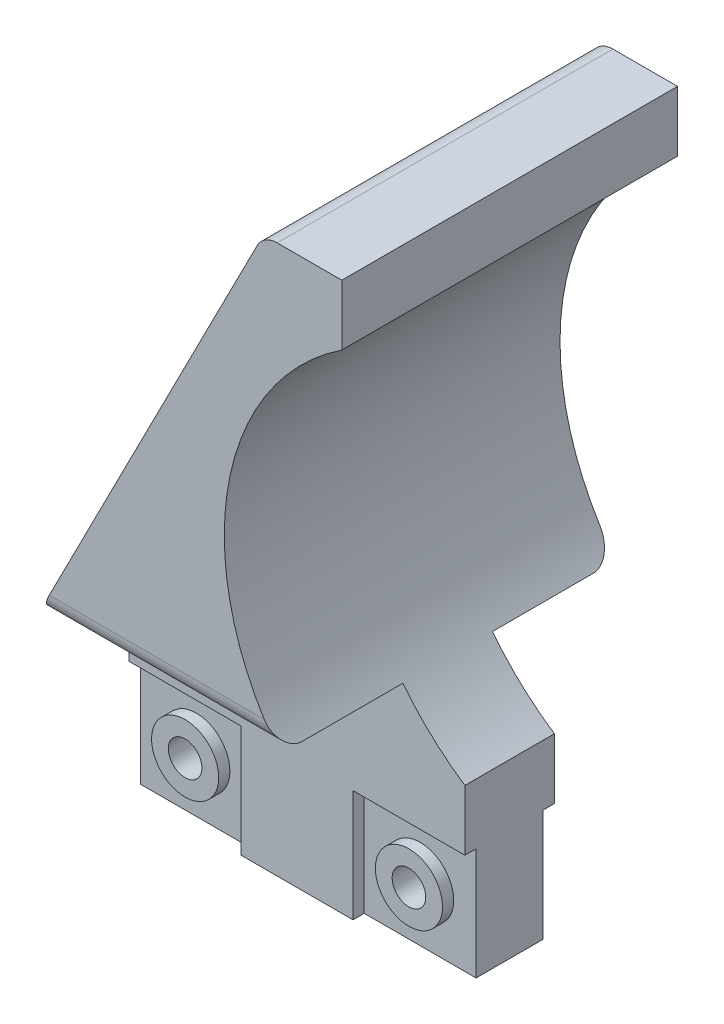
ISO-10303-21;
HEADER;
FILE_DESCRIPTION(('STEP AP214'),'2;1');
FILE_NAME('part.step','',(''),(''),'','','');
FILE_SCHEMA(('AUTOMOTIVE_DESIGN { 1 0 10303 214 1 1 1 1 }'));
ENDSEC;
DATA;
#1=APPLICATION_CONTEXT('core data for automotive mechanical design processes');
#2=APPLICATION_PROTOCOL_DEFINITION('international standard','automotive_design',2000,#1);
#3=PRODUCT_CONTEXT('',#1,'mechanical');
#4=PRODUCT('Part','Part','',(#3));
#5=PRODUCT_RELATED_PRODUCT_CATEGORY('part','',(#4));
#6=PRODUCT_DEFINITION_FORMATION('','',#4);
#7=PRODUCT_DEFINITION_CONTEXT('part definition',#1,'design');
#8=PRODUCT_DEFINITION('design','',#6,#7);
#9=PRODUCT_DEFINITION_SHAPE('','',#8);
#10=(LENGTH_UNIT() NAMED_UNIT(*) SI_UNIT(.MILLI.,.METRE.));
#11=(NAMED_UNIT(*) PLANE_ANGLE_UNIT() SI_UNIT($,.RADIAN.));
#12=(NAMED_UNIT(*) SI_UNIT($,.STERADIAN.) SOLID_ANGLE_UNIT());
#13=UNCERTAINTY_MEASURE_WITH_UNIT(LENGTH_MEASURE(1.E-05),#10,'distance_accuracy_value','');
#14=(GEOMETRIC_REPRESENTATION_CONTEXT(3) GLOBAL_UNCERTAINTY_ASSIGNED_CONTEXT((#13)) GLOBAL_UNIT_ASSIGNED_CONTEXT((#10,
#11,#12)) REPRESENTATION_CONTEXT('',''));
#15=CARTESIAN_POINT('',(0.,0.,0.));
#16=DIRECTION('',(0.,0.,1.));
#17=DIRECTION('',(1.,0.,0.));
#18=AXIS2_PLACEMENT_3D('',#15,#16,#17);
#19=CARTESIAN_POINT('',(28.0357142857143,35.,0.));
#20=DIRECTION('',(0.,0.,1.));
#21=DIRECTION('',(1.,0.,0.));
#22=AXIS2_PLACEMENT_3D('',#19,#20,#21);
#23=PLANE('',#22);
#24=CARTESIAN_POINT('',(10.,5.,0.));
#25=DIRECTION('',(0.,0.,1.));
#26=DIRECTION('',(1.,0.,0.));
#27=AXIS2_PLACEMENT_3D('',#24,#25,#26);
#28=CIRCLE('',#27,1.5);
#29=CARTESIAN_POINT('',(11.5,5.,0.));
#30=VERTEX_POINT('',#29);
#31=EDGE_CURVE('E503',#30,#30,#28,.T.);
#32=ORIENTED_EDGE('',*,*,#31,.T.);
#33=EDGE_LOOP('',(#32));
#34=FACE_BOUND('',#33,.T.);
#35=CARTESIAN_POINT('',(10.,5.,0.));
#36=DIRECTION('',(0.,0.,-1.));
#37=DIRECTION('',(-1.,0.,0.));
#38=AXIS2_PLACEMENT_3D('',#35,#36,#37);
#39=CIRCLE('',#38,3.);
#40=CARTESIAN_POINT('',(7.00000000000001,5.,0.));
#41=VERTEX_POINT('',#40);
#42=EDGE_CURVE('E607',#41,#41,#39,.T.);
#43=ORIENTED_EDGE('',*,*,#42,.T.);
#44=EDGE_LOOP('',(#43));
#45=FACE_BOUND('',#44,.T.);
#46=ADVANCED_FACE('F39',(#34,#45),#23,.F.);
#47=CARTESIAN_POINT('',(-9.99999999999999,5.,0.));
#48=DIRECTION('',(0.,0.,1.));
#49=DIRECTION('',(1.,0.,0.));
#50=AXIS2_PLACEMENT_3D('',#47,#48,#49);
#51=CIRCLE('',#50,1.5);
#52=CARTESIAN_POINT('',(-8.49999999999999,5.,0.));
#53=VERTEX_POINT('',#52);
#54=EDGE_CURVE('E614',#53,#53,#51,.T.);
#55=ORIENTED_EDGE('',*,*,#54,.T.);
#56=EDGE_LOOP('',(#55));
#57=FACE_BOUND('',#56,.T.);
#58=CARTESIAN_POINT('',(-9.99999999999999,5.,0.));
#59=DIRECTION('',(0.,0.,-1.));
#60=DIRECTION('',(-1.,0.,0.));
#61=AXIS2_PLACEMENT_3D('',#58,#59,#60);
#62=CIRCLE('',#61,3.);
#63=CARTESIAN_POINT('',(-13.,5.,0.));
#64=VERTEX_POINT('',#63);
#65=EDGE_CURVE('E597',#64,#64,#62,.T.);
#66=ORIENTED_EDGE('',*,*,#65,.T.);
#67=EDGE_LOOP('',(#66));
#68=FACE_BOUND('',#67,.T.);
#69=ADVANCED_FACE('F334',(#57,#68),#23,.F.);
#70=CARTESIAN_POINT('',(15.,10.,8.));
#71=DIRECTION('',(0.,1.,0.));
#72=DIRECTION('',(0.,0.,1.));
#73=AXIS2_PLACEMENT_3D('',#70,#71,#72);
#74=PLANE('',#73);
#75=DIRECTION('',(1.,0.,0.));
#76=VECTOR('',#75,1.);
#77=CARTESIAN_POINT('',(15.,10.,7.));
#78=LINE('',#77,#76);
#79=CARTESIAN_POINT('',(5.,10.,7.));
#80=VERTEX_POINT('',#79);
#81=CARTESIAN_POINT('',(15.,10.,7.));
#82=VERTEX_POINT('',#81);
#83=EDGE_CURVE('E243',#80,#82,#78,.T.);
#84=ORIENTED_EDGE('',*,*,#83,.T.);
#85=DIRECTION('',(0.,0.,-1.));
#86=VECTOR('',#85,1.);
#87=CARTESIAN_POINT('',(15.,10.,8.));
#88=LINE('',#87,#86);
#89=CARTESIAN_POINT('',(15.,10.,8.));
#90=VERTEX_POINT('',#89);
#91=EDGE_CURVE('E361',#90,#82,#88,.T.);
#92=ORIENTED_EDGE('',*,*,#91,.F.);
#93=DIRECTION('',(1.,0.,0.));
#94=VECTOR('',#93,1.);
#95=CARTESIAN_POINT('',(15.,10.,8.));
#96=LINE('',#95,#94);
#97=CARTESIAN_POINT('',(5.,10.,8.));
#98=VERTEX_POINT('',#97);
#99=EDGE_CURVE('E242',#98,#90,#96,.T.);
#100=ORIENTED_EDGE('',*,*,#99,.F.);
#101=DIRECTION('',(0.,0.,-1.));
#102=VECTOR('',#101,1.);
#103=CARTESIAN_POINT('',(5.,10.,8.));
#104=LINE('',#103,#102);
#105=EDGE_CURVE('E431',#98,#80,#104,.T.);
#106=ORIENTED_EDGE('',*,*,#105,.T.);
#107=EDGE_LOOP('',(#84,#92,#100,#106));
#108=FACE_BOUND('',#107,.T.);
#109=ADVANCED_FACE('F339',(#108),#74,.F.);
#110=CARTESIAN_POINT('',(5.,10.,8.));
#111=DIRECTION('',(-1.,0.,0.));
#112=DIRECTION('',(0.,0.,1.));
#113=AXIS2_PLACEMENT_3D('',#110,#111,#112);
#114=PLANE('',#113);
#115=DIRECTION('',(0.,1.,0.));
#116=VECTOR('',#115,1.);
#117=CARTESIAN_POINT('',(5.,10.,7.));
#118=LINE('',#117,#116);
#119=CARTESIAN_POINT('',(5.,0.,7.));
#120=VERTEX_POINT('',#119);
#121=EDGE_CURVE('E249',#120,#80,#118,.T.);
#122=ORIENTED_EDGE('',*,*,#121,.T.);
#123=ORIENTED_EDGE('',*,*,#105,.F.);
#124=DIRECTION('',(0.,1.,0.));
#125=VECTOR('',#124,1.);
#126=CARTESIAN_POINT('',(5.,10.,8.));
#127=LINE('',#126,#125);
#128=CARTESIAN_POINT('',(5.,0.,8.));
#129=VERTEX_POINT('',#128);
#130=EDGE_CURVE('E43',#129,#98,#127,.T.);
#131=ORIENTED_EDGE('',*,*,#130,.F.);
#132=DIRECTION('',(0.,0.,-1.));
#133=VECTOR('',#132,1.);
#134=CARTESIAN_POINT('',(5.,0.,8.));
#135=LINE('',#134,#133);
#136=EDGE_CURVE('E438',#129,#120,#135,.T.);
#137=ORIENTED_EDGE('',*,*,#136,.T.);
#138=EDGE_LOOP('',(#122,#123,#131,#137));
#139=FACE_BOUND('',#138,.T.);
#140=ADVANCED_FACE('F349',(#139),#114,.F.);
#141=CARTESIAN_POINT('',(28.0357142857143,35.,8.));
#142=DIRECTION('',(0.,0.,1.));
#143=DIRECTION('',(1.,0.,0.));
#144=AXIS2_PLACEMENT_3D('',#141,#142,#143);
#145=PLANE('',#144);
#146=ORIENTED_EDGE('',*,*,#99,.T.);
#147=DIRECTION('',(0.,1.,0.));
#148=VECTOR('',#147,1.);
#149=CARTESIAN_POINT('',(15.,15.4040820577346,8.));
#150=LINE('',#149,#148);
#151=CARTESIAN_POINT('',(15.,15.4040820577346,8.));
#152=VERTEX_POINT('',#151);
#153=EDGE_CURVE('E248',#90,#152,#150,.T.);
#154=ORIENTED_EDGE('',*,*,#153,.T.);
#155=CARTESIAN_POINT('',(28.0357142857143,35.,8.));
#156=DIRECTION('',(0.,0.,-1.));
#157=DIRECTION('',(1.,0.,0.));
#158=AXIS2_PLACEMENT_3D('',#155,#156,#157);
#159=CIRCLE('',#158,23.5357142857143);
#160=CARTESIAN_POINT('',(9.46277817081413,20.5440015560802,8.));
#161=VERTEX_POINT('',#160);
#162=EDGE_CURVE('E382',#152,#161,#159,.T.);
#163=ORIENTED_EDGE('',*,*,#162,.T.);
#164=DIRECTION('',(1.,0.,0.));
#165=VECTOR('',#164,1.);
#166=CARTESIAN_POINT('',(28.0357142857143,20.5440015560802,8.));
#167=LINE('',#166,#165);
#168=CARTESIAN_POINT('',(-12.1663992046701,20.5440015560802,8.));
#169=VERTEX_POINT('',#168);
#170=EDGE_CURVE('E396',#169,#161,#167,.T.);
#171=ORIENTED_EDGE('',*,*,#170,.F.);
#172=DIRECTION('',(-0.455111059789108,-0.890434682196081,0.));
#173=VECTOR('',#172,1.);
#174=CARTESIAN_POINT('',(-15.,15.,8.));
#175=LINE('',#174,#173);
#176=CARTESIAN_POINT('',(-15.,15.,8.));
#177=VERTEX_POINT('',#176);
#178=EDGE_CURVE('E378',#169,#177,#175,.T.);
#179=ORIENTED_EDGE('',*,*,#178,.T.);
#180=DIRECTION('',(0.,-1.,0.));
#181=VECTOR('',#180,1.);
#182=CARTESIAN_POINT('',(-15.,0.,8.));
#183=LINE('',#182,#181);
#184=CARTESIAN_POINT('',(-15.,10.,8.));
#185=VERTEX_POINT('',#184);
#186=EDGE_CURVE('E381',#177,#185,#183,.T.);
#187=ORIENTED_EDGE('',*,*,#186,.T.);
#188=DIRECTION('',(1.,0.,0.));
#189=VECTOR('',#188,1.);
#190=CARTESIAN_POINT('',(-15.,10.,8.));
#191=LINE('',#190,#189);
#192=CARTESIAN_POINT('',(-5.,10.,8.));
#193=VERTEX_POINT('',#192);
#194=EDGE_CURVE('E395',#185,#193,#191,.T.);
#195=ORIENTED_EDGE('',*,*,#194,.T.);
#196=DIRECTION('',(0.,-1.,0.));
#197=VECTOR('',#196,1.);
#198=CARTESIAN_POINT('',(-5.,10.,8.));
#199=LINE('',#198,#197);
#200=CARTESIAN_POINT('',(-5.,0.,8.));
#201=VERTEX_POINT('',#200);
#202=EDGE_CURVE('E391',#193,#201,#199,.T.);
#203=ORIENTED_EDGE('',*,*,#202,.T.);
#204=DIRECTION('',(1.,0.,0.));
#205=VECTOR('',#204,1.);
#206=CARTESIAN_POINT('',(-15.,0.,8.));
#207=LINE('',#206,#205);
#208=EDGE_CURVE('E387',#201,#129,#207,.T.);
#209=ORIENTED_EDGE('',*,*,#208,.T.);
#210=ORIENTED_EDGE('',*,*,#130,.T.);
#211=EDGE_LOOP('',(#146,#154,#163,#171,#179,#187,#195,#203,#209,#210));
#212=FACE_BOUND('',#211,.T.);
#213=ADVANCED_FACE('F344',(#212),#145,.T.);
#214=DIRECTION('',(0.,1.,0.));
#215=VECTOR('',#214,1.);
#216=CARTESIAN_POINT('',(15.,15.4040820577346,0.));
#217=LINE('',#216,#215);
#218=CARTESIAN_POINT('',(15.,10.,0.));
#219=VERTEX_POINT('',#218);
#220=CARTESIAN_POINT('',(15.,15.4040820577346,0.));
#221=VERTEX_POINT('',#220);
#222=EDGE_CURVE('E291',#219,#221,#217,.T.);
#223=ORIENTED_EDGE('',*,*,#222,.F.);
#224=DIRECTION('',(1.,0.,0.));
#225=VECTOR('',#224,1.);
#226=CARTESIAN_POINT('',(15.,10.,0.));
#227=LINE('',#226,#225);
#228=CARTESIAN_POINT('',(5.,10.,0.));
#229=VERTEX_POINT('',#228);
#230=EDGE_CURVE('E224',#229,#219,#227,.T.);
#231=ORIENTED_EDGE('',*,*,#230,.F.);
#232=DIRECTION('',(0.,1.,0.));
#233=VECTOR('',#232,1.);
#234=CARTESIAN_POINT('',(5.,10.,0.));
#235=LINE('',#234,#233);
#236=CARTESIAN_POINT('',(5.,0.,0.));
#237=VERTEX_POINT('',#236);
#238=EDGE_CURVE('E657',#237,#229,#235,.T.);
#239=ORIENTED_EDGE('',*,*,#238,.F.);
#240=DIRECTION('',(1.,0.,0.));
#241=VECTOR('',#240,1.);
#242=CARTESIAN_POINT('',(-15.,0.,0.));
#243=LINE('',#242,#241);
#244=CARTESIAN_POINT('',(-5.,0.,0.));
#245=VERTEX_POINT('',#244);
#246=EDGE_CURVE('E369',#245,#237,#243,.T.);
#247=ORIENTED_EDGE('',*,*,#246,.F.);
#248=DIRECTION('',(0.,-1.,0.));
#249=VECTOR('',#248,1.);
#250=CARTESIAN_POINT('',(-5.,10.,0.));
#251=LINE('',#250,#249);
#252=CARTESIAN_POINT('',(-5.,10.,0.));
#253=VERTEX_POINT('',#252);
#254=EDGE_CURVE('E587',#253,#245,#251,.T.);
#255=ORIENTED_EDGE('',*,*,#254,.F.);
#256=DIRECTION('',(1.,0.,0.));
#257=VECTOR('',#256,1.);
#258=CARTESIAN_POINT('',(-15.,10.,0.));
#259=LINE('',#258,#257);
#260=CARTESIAN_POINT('',(-15.,10.,0.));
#261=VERTEX_POINT('',#260);
#262=EDGE_CURVE('E585',#261,#253,#259,.T.);
#263=ORIENTED_EDGE('',*,*,#262,.F.);
#264=DIRECTION('',(0.,-1.,0.));
#265=VECTOR('',#264,1.);
#266=CARTESIAN_POINT('',(-15.,0.,0.));
#267=LINE('',#266,#265);
#268=CARTESIAN_POINT('',(-15.,15.,0.));
#269=VERTEX_POINT('',#268);
#270=EDGE_CURVE('E373',#269,#261,#267,.T.);
#271=ORIENTED_EDGE('',*,*,#270,.F.);
#272=DIRECTION('',(-0.455111059789108,-0.890434682196081,0.));
#273=VECTOR('',#272,1.);
#274=CARTESIAN_POINT('',(-15.,15.,0.));
#275=LINE('',#274,#273);
#276=CARTESIAN_POINT('',(-12.1663992046701,20.5440015560802,0.));
#277=VERTEX_POINT('',#276);
#278=EDGE_CURVE('E408',#277,#269,#275,.T.);
#279=ORIENTED_EDGE('',*,*,#278,.F.);
#280=DIRECTION('',(1.,0.,0.));
#281=VECTOR('',#280,1.);
#282=CARTESIAN_POINT('',(28.0357142857143,20.5440015560802,0.));
#283=LINE('',#282,#281);
#284=CARTESIAN_POINT('',(9.46277817081413,20.5440015560802,0.));
#285=VERTEX_POINT('',#284);
#286=EDGE_CURVE('E377',#277,#285,#283,.T.);
#287=ORIENTED_EDGE('',*,*,#286,.T.);
#288=CARTESIAN_POINT('',(28.0357142857143,35.,0.));
#289=DIRECTION('',(0.,0.,-1.));
#290=DIRECTION('',(1.,0.,0.));
#291=AXIS2_PLACEMENT_3D('',#288,#289,#290);
#292=CIRCLE('',#291,23.5357142857143);
#293=EDGE_CURVE('E357',#221,#285,#292,.T.);
#294=ORIENTED_EDGE('',*,*,#293,.F.);
#295=EDGE_LOOP('',(#223,#231,#239,#247,#255,#263,#271,#279,#287,#294));
#296=FACE_BOUND('',#295,.T.);
#297=ADVANCED_FACE('F41',(#296),#23,.F.);
#298=CARTESIAN_POINT('',(-15.,0.,8.));
#299=DIRECTION('',(1.,0.,0.));
#300=DIRECTION('',(0.,0.,-1.));
#301=AXIS2_PLACEMENT_3D('',#298,#299,#300);
#302=PLANE('',#301);
#303=ORIENTED_EDGE('',*,*,#270,.T.);
#304=DIRECTION('',(0.,0.,-1.));
#305=VECTOR('',#304,1.);
#306=CARTESIAN_POINT('',(-15.,10.,1.));
#307=LINE('',#306,#305);
#308=CARTESIAN_POINT('',(-15.,10.,1.));
#309=VERTEX_POINT('',#308);
#310=EDGE_CURVE('E611',#309,#261,#307,.T.);
#311=ORIENTED_EDGE('',*,*,#310,.F.);
#312=DIRECTION('',(0.,1.,0.));
#313=VECTOR('',#312,1.);
#314=CARTESIAN_POINT('',(-15.,10.,1.));
#315=LINE('',#314,#313);
#316=CARTESIAN_POINT('',(-15.,0.,1.));
#317=VERTEX_POINT('',#316);
#318=EDGE_CURVE('E594',#317,#309,#315,.T.);
#319=ORIENTED_EDGE('',*,*,#318,.F.);
#320=DIRECTION('',(0.,0.,-1.));
#321=VECTOR('',#320,1.);
#322=CARTESIAN_POINT('',(-15.,0.,7.));
#323=LINE('',#322,#321);
#324=CARTESIAN_POINT('',(-15.,0.,7.));
#325=VERTEX_POINT('',#324);
#326=EDGE_CURVE('E490',#325,#317,#323,.T.);
#327=ORIENTED_EDGE('',*,*,#326,.F.);
#328=DIRECTION('',(0.,1.,0.));
#329=VECTOR('',#328,1.);
#330=CARTESIAN_POINT('',(-15.,10.,7.));
#331=LINE('',#330,#329);
#332=CARTESIAN_POINT('',(-15.,10.,7.));
#333=VERTEX_POINT('',#332);
#334=EDGE_CURVE('E488',#325,#333,#331,.T.);
#335=ORIENTED_EDGE('',*,*,#334,.T.);
#336=DIRECTION('',(0.,0.,-1.));
#337=VECTOR('',#336,1.);
#338=CARTESIAN_POINT('',(-15.,10.,8.));
#339=LINE('',#338,#337);
#340=EDGE_CURVE('E11',#185,#333,#339,.T.);
#341=ORIENTED_EDGE('',*,*,#340,.F.);
#342=ORIENTED_EDGE('',*,*,#186,.F.);
#343=DIRECTION('',(0.,0.,-1.));
#344=VECTOR('',#343,1.);
#345=CARTESIAN_POINT('',(-15.,15.,8.));
#346=LINE('',#345,#344);
#347=EDGE_CURVE('E372',#177,#269,#346,.T.);
#348=ORIENTED_EDGE('',*,*,#347,.T.);
#349=EDGE_LOOP('',(#303,#311,#319,#327,#335,#341,#342,#348));
#350=FACE_BOUND('',#349,.T.);
#351=ADVANCED_FACE('F326',(#350),#302,.F.);
#352=CARTESIAN_POINT('',(-15.,0.,8.));
#353=DIRECTION('',(0.,1.,0.));
#354=DIRECTION('',(0.,0.,1.));
#355=AXIS2_PLACEMENT_3D('',#352,#353,#354);
#356=PLANE('',#355);
#357=ORIENTED_EDGE('',*,*,#246,.T.);
#358=DIRECTION('',(0.,0.,-1.));
#359=VECTOR('',#358,1.);
#360=CARTESIAN_POINT('',(5.,0.,1.));
#361=LINE('',#360,#359);
#362=CARTESIAN_POINT('',(5.,0.,1.));
#363=VERTEX_POINT('',#362);
#364=EDGE_CURVE('E232',#363,#237,#361,.T.);
#365=ORIENTED_EDGE('',*,*,#364,.F.);
#366=DIRECTION('',(-1.,0.,0.));
#367=VECTOR('',#366,1.);
#368=CARTESIAN_POINT('',(15.,0.,1.));
#369=LINE('',#368,#367);
#370=CARTESIAN_POINT('',(15.,0.,1.));
#371=VERTEX_POINT('',#370);
#372=EDGE_CURVE('E218',#371,#363,#369,.T.);
#373=ORIENTED_EDGE('',*,*,#372,.F.);
#374=DIRECTION('',(0.,0.,-1.));
#375=VECTOR('',#374,1.);
#376=CARTESIAN_POINT('',(15.,0.,7.));
#377=LINE('',#376,#375);
#378=CARTESIAN_POINT('',(15.,0.,7.));
#379=VERTEX_POINT('',#378);
#380=EDGE_CURVE('E230',#379,#371,#377,.T.);
#381=ORIENTED_EDGE('',*,*,#380,.F.);
#382=DIRECTION('',(-1.,0.,0.));
#383=VECTOR('',#382,1.);
#384=CARTESIAN_POINT('',(15.,0.,7.));
#385=LINE('',#384,#383);
#386=EDGE_CURVE('E460',#379,#120,#385,.T.);
#387=ORIENTED_EDGE('',*,*,#386,.T.);
#388=ORIENTED_EDGE('',*,*,#136,.F.);
#389=ORIENTED_EDGE('',*,*,#208,.F.);
#390=DIRECTION('',(0.,0.,-1.));
#391=VECTOR('',#390,1.);
#392=CARTESIAN_POINT('',(-5.,0.,8.));
#393=LINE('',#392,#391);
#394=CARTESIAN_POINT('',(-5.,0.,7.));
#395=VERTEX_POINT('',#394);
#396=EDGE_CURVE('E364',#201,#395,#393,.T.);
#397=ORIENTED_EDGE('',*,*,#396,.T.);
#398=DIRECTION('',(-1.,0.,0.));
#399=VECTOR('',#398,1.);
#400=CARTESIAN_POINT('',(-15.,0.,7.));
#401=LINE('',#400,#399);
#402=EDGE_CURVE('E482',#395,#325,#401,.T.);
#403=ORIENTED_EDGE('',*,*,#402,.T.);
#404=ORIENTED_EDGE('',*,*,#326,.T.);
#405=DIRECTION('',(-1.,0.,0.));
#406=VECTOR('',#405,1.);
#407=CARTESIAN_POINT('',(-15.,0.,1.));
#408=LINE('',#407,#406);
#409=CARTESIAN_POINT('',(-5.,0.,1.));
#410=VERTEX_POINT('',#409);
#411=EDGE_CURVE('E600',#410,#317,#408,.T.);
#412=ORIENTED_EDGE('',*,*,#411,.F.);
#413=DIRECTION('',(0.,0.,-1.));
#414=VECTOR('',#413,1.);
#415=CARTESIAN_POINT('',(-5.,0.,1.));
#416=LINE('',#415,#414);
#417=EDGE_CURVE('E603',#410,#245,#416,.T.);
#418=ORIENTED_EDGE('',*,*,#417,.T.);
#419=EDGE_LOOP('',(#357,#365,#373,#381,#387,#388,#389,#397,#403,#404,#412,#418));
#420=FACE_BOUND('',#419,.T.);
#421=ADVANCED_FACE('F228',(#420),#356,.F.);
#422=CARTESIAN_POINT('',(15.,15.4040820577346,8.));
#423=DIRECTION('',(-1.,0.,0.));
#424=DIRECTION('',(0.,-1.,0.));
#425=AXIS2_PLACEMENT_3D('',#422,#423,#424);
#426=PLANE('',#425);
#427=DIRECTION('',(0.,-1.,0.));
#428=VECTOR('',#427,1.);
#429=CARTESIAN_POINT('',(15.,10.,1.));
#430=LINE('',#429,#428);
#431=CARTESIAN_POINT('',(15.,10.,1.));
#432=VERTEX_POINT('',#431);
#433=EDGE_CURVE('E215',#432,#371,#430,.T.);
#434=ORIENTED_EDGE('',*,*,#433,.F.);
#435=DIRECTION('',(0.,0.,-1.));
#436=VECTOR('',#435,1.);
#437=CARTESIAN_POINT('',(15.,10.,1.));
#438=LINE('',#437,#436);
#439=EDGE_CURVE('E623',#432,#219,#438,.T.);
#440=ORIENTED_EDGE('',*,*,#439,.T.);
#441=ORIENTED_EDGE('',*,*,#222,.T.);
#442=DIRECTION('',(0.,0.,-1.));
#443=VECTOR('',#442,1.);
#444=CARTESIAN_POINT('',(15.,15.4040820577346,8.));
#445=LINE('',#444,#443);
#446=EDGE_CURVE('E316',#152,#221,#445,.T.);
#447=ORIENTED_EDGE('',*,*,#446,.F.);
#448=ORIENTED_EDGE('',*,*,#153,.F.);
#449=ORIENTED_EDGE('',*,*,#91,.T.);
#450=DIRECTION('',(0.,-1.,0.));
#451=VECTOR('',#450,1.);
#452=CARTESIAN_POINT('',(15.,10.,7.));
#453=LINE('',#452,#451);
#454=EDGE_CURVE('E240',#82,#379,#453,.T.);
#455=ORIENTED_EDGE('',*,*,#454,.T.);
#456=ORIENTED_EDGE('',*,*,#380,.T.);
#457=EDGE_LOOP('',(#434,#440,#441,#447,#448,#449,#455,#456));
#458=FACE_BOUND('',#457,.T.);
#459=ADVANCED_FACE('F237',(#458),#426,.F.);
#460=CARTESIAN_POINT('',(28.0357142857143,35.,8.));
#461=DIRECTION('',(0.,0.,-1.));
#462=DIRECTION('',(-1.,0.,0.));
#463=AXIS2_PLACEMENT_3D('',#460,#461,#462);
#464=CYLINDRICAL_SURFACE('',#463,23.5357142857143);
#465=DIRECTION('',(0.,0.,1.));
#466=VECTOR('',#465,1.);
#467=CARTESIAN_POINT('',(9.46277817081413,20.5440015560802,-11.));
#468=LINE('',#467,#466);
#469=CARTESIAN_POINT('',(9.46277817081413,20.5440015560802,-9.));
#470=VERTEX_POINT('',#469);
#471=EDGE_CURVE('E402',#470,#285,#468,.T.);
#472=ORIENTED_EDGE('',*,*,#471,.F.);
#473=CARTESIAN_POINT('',(9.46277817081413,20.5440015560802,-9.));
#474=CARTESIAN_POINT('',(9.46278778264955,20.5439912860713,-9.04826465668858));
#475=CARTESIAN_POINT('',(9.46141862951719,20.5457483274586,-9.09652194682469));
#476=CARTESIAN_POINT('',(9.45599625780306,20.5527178909817,-9.19260672242341));
#477=CARTESIAN_POINT('',(9.45194463063311,20.557928364327,-9.24043444569061));
#478=CARTESIAN_POINT('',(9.44126566651171,20.5716806828838,-9.33499278394975));
#479=CARTESIAN_POINT('',(9.43465535594298,20.5802005077868,-9.38172852978646));
#480=CARTESIAN_POINT('',(9.41899404248133,20.6004257795668,-9.47407889576703));
#481=CARTESIAN_POINT('',(9.40994279705968,20.6121315429963,-9.51969340401424));
#482=CARTESIAN_POINT('',(9.3794044740843,20.6517225029473,-9.65420246142124));
#483=CARTESIAN_POINT('',(9.35449908710464,20.6841244023061,-9.74104900953231));
#484=CARTESIAN_POINT('',(9.29708571391248,20.7593583044711,-9.90742638180532));
#485=CARTESIAN_POINT('',(9.26456585088897,20.8022066055816,-9.98694550407507));
#486=CARTESIAN_POINT('',(9.19055616274088,20.9005693107304,-10.1438501453988));
#487=CARTESIAN_POINT('',(9.14854676439779,20.9568384138374,-10.2205146364847));
#488=CARTESIAN_POINT('',(9.05925758771852,21.0777302689992,-10.3633851666302));
#489=CARTESIAN_POINT('',(9.01197676349062,21.1423546792192,-10.4295891239181));
#490=CARTESIAN_POINT('',(8.90359753630854,21.2922602763121,-10.5637157487919));
#491=CARTESIAN_POINT('',(8.84164554464999,21.37906858024,-10.6292452025552));
#492=CARTESIAN_POINT('',(8.71431200414487,21.5602980232691,-10.7446785123169));
#493=CARTESIAN_POINT('',(8.64892599970086,21.6547291426437,-10.79456145161));
#494=CARTESIAN_POINT('',(8.49739822649028,21.8772388770339,-10.890497833315));
#495=CARTESIAN_POINT('',(8.41067318823541,22.0072110004804,-10.9313669439443));
#496=CARTESIAN_POINT('',(8.28087630061509,22.2061517611354,-10.9724225348696));
#497=CARTESIAN_POINT('',(8.23766579792703,22.2731184119949,-10.9827330227732));
#498=CARTESIAN_POINT('',(8.15162543799745,22.4079684154694,-10.9965155426311));
#499=CARTESIAN_POINT('',(8.10879548718025,22.4758515317712,-10.9999893047829));
#500=CARTESIAN_POINT('',(8.06628891331457,22.5440015560802,-11.));
#501=B_SPLINE_CURVE_WITH_KNOTS('',3,(#473,#474,#475,#476,#477,#478,#479,#480,#481,#482,#483,
#484,#485,#486,#487,#488,#489,#490,#491,#492,#493,#494,#495,#496,#497,#498,#499,#500),
.UNSPECIFIED.,.F.,.F.,(4,2,2,2,2,2,2,2,2,2,2,2,2,4),(0.,0.144730515928066,0.289375245484268,
0.433073561271764,0.576786160036746,0.863347825112885,1.15035947272318,1.4611205861846,
1.77194346715215,2.14603502374451,2.52062456593402,3.00244935115899,3.24328702361067,
3.48406373846967),.UNSPECIFIED.);
#502=CARTESIAN_POINT('',(8.06628891331457,22.5440015560802,-11.));
#503=VERTEX_POINT('',#502);
#504=EDGE_CURVE('E281',#470,#503,#501,.T.);
#505=ORIENTED_EDGE('',*,*,#504,.T.);
#506=CARTESIAN_POINT('',(28.0357142857144,35.,-11.));
#507=DIRECTION('',(0.,0.,-1.));
#508=DIRECTION('',(1.,0.,0.));
#509=AXIS2_PLACEMENT_3D('',#506,#507,#508);
#510=CIRCLE('',#509,23.5357142857144);
#511=CARTESIAN_POINT('',(15.,54.5959179422654,-11.));
#512=VERTEX_POINT('',#511);
#513=EDGE_CURVE('E290',#503,#512,#510,.T.);
#514=ORIENTED_EDGE('',*,*,#513,.T.);
#515=DIRECTION('',(0.,0.,-1.));
#516=VECTOR('',#515,1.);
#517=CARTESIAN_POINT('',(15.,54.5959179422654,8.));
#518=LINE('',#517,#516);
#519=CARTESIAN_POINT('',(15.,54.5959179422654,19.));
#520=VERTEX_POINT('',#519);
#521=EDGE_CURVE('E419',#520,#512,#518,.T.);
#522=ORIENTED_EDGE('',*,*,#521,.F.);
#523=CARTESIAN_POINT('',(28.0357142857144,35.,19.));
#524=DIRECTION('',(0.,0.,-1.));
#525=DIRECTION('',(1.,0.,0.));
#526=AXIS2_PLACEMENT_3D('',#523,#524,#525);
#527=CIRCLE('',#526,23.5357142857144);
#528=CARTESIAN_POINT('',(8.06628891331457,22.5440015560802,19.));
#529=VERTEX_POINT('',#528);
#530=EDGE_CURVE('E432',#529,#520,#527,.T.);
#531=ORIENTED_EDGE('',*,*,#530,.F.);
#532=CARTESIAN_POINT('',(8.06628891331457,22.5440015560802,19.));
#533=CARTESIAN_POINT('',(8.1112634423205,22.4718936109539,18.9999875371441));
#534=CARTESIAN_POINT('',(8.15660118942526,22.4000843330383,18.9960991559721));
#535=CARTESIAN_POINT('',(8.24767649523542,22.2575296649002,18.9806790899556));
#536=CARTESIAN_POINT('',(8.29341412076328,22.1867844580804,18.9691461025863));
#537=CARTESIAN_POINT('',(8.43118096026569,21.9761671151226,18.9230888048595));
#538=CARTESIAN_POINT('',(8.52329779835269,21.8386598557111,18.8771081249765));
#539=CARTESIAN_POINT('',(8.69693752027963,21.5849539803893,18.7601881415762));
#540=CARTESIAN_POINT('',(8.77873250243427,21.4679300448428,18.6914203556828));
#541=CARTESIAN_POINT('',(8.93545041573926,21.2476221064516,18.5290573967925));
#542=CARTESIAN_POINT('',(9.01039546372516,21.1442933606629,18.4355462209092));
#543=CARTESIAN_POINT('',(9.12863182482456,20.9836164676011,18.2550918034805));
#544=CARTESIAN_POINT('',(9.17479271161207,20.9216323195958,18.1741368470206));
#545=CARTESIAN_POINT('',(9.2591823190664,20.8092771609555,18.0007016188246));
#546=CARTESIAN_POINT('',(9.29741120312857,20.7589059110981,17.9082215845622));
#547=CARTESIAN_POINT('',(9.36377017684191,20.6720060044009,17.7121746965955));
#548=CARTESIAN_POINT('',(9.39179555308634,20.635620677437,17.6085063055522));
#549=CARTESIAN_POINT('',(9.42394658333055,20.5940205011085,17.4479355820039));
#550=CARTESIAN_POINT('',(9.43301280415412,20.5823204742883,17.3936078653449));
#551=CARTESIAN_POINT('',(9.4476554027273,20.5634470587195,17.2837241484507));
#552=CARTESIAN_POINT('',(9.45323473836985,20.5562698332766,17.2281692307771));
#553=CARTESIAN_POINT('',(9.45891798208593,20.548962168454,17.1436865830157));
#554=CARTESIAN_POINT('',(9.46036519858975,20.5471021313182,17.1149822231271));
#555=CARTESIAN_POINT('',(9.46229495207602,20.5446223643762,17.0575205922952));
#556=CARTESIAN_POINT('',(9.46277858982471,20.5440012192924,17.0287634193335));
#557=CARTESIAN_POINT('',(9.4627781708141,20.5440015560802,17.));
#558=B_SPLINE_CURVE_WITH_KNOTS('',3,(#532,#533,#534,#535,#536,#537,#538,#539,#540,#541,#542,
#543,#544,#545,#546,#547,#548,#549,#550,#551,#552,#553,#554,#555,#556,#557),.UNSPECIFIED.,.F.,
.F.,(4,2,2,2,2,2,2,2,2,2,2,2,4),(0.,0.254745028920659,0.509533473687065,1.02171311085048,
1.49482162105064,1.966344214579,2.30084173691015,2.63533236807223,2.97316490564461,
3.14184075408737,3.3103733214321,3.39673922045515,3.48300640071759),.UNSPECIFIED.);
#559=CARTESIAN_POINT('',(9.46277817081413,20.5440015560802,17.));
#560=VERTEX_POINT('',#559);
#561=EDGE_CURVE('E308',#529,#560,#558,.T.);
#562=ORIENTED_EDGE('',*,*,#561,.T.);
#563=EDGE_CURVE('E405',#161,#560,#468,.T.);
#564=ORIENTED_EDGE('',*,*,#563,.F.);
#565=ORIENTED_EDGE('',*,*,#162,.F.);
#566=ORIENTED_EDGE('',*,*,#446,.T.);
#567=ORIENTED_EDGE('',*,*,#293,.T.);
#568=EDGE_LOOP('',(#472,#505,#514,#522,#531,#562,#564,#565,#566,#567));
#569=FACE_BOUND('',#568,.T.);
#570=ADVANCED_FACE('F297',(#569),#464,.F.);
#571=CARTESIAN_POINT('',(15.,60.,8.));
#572=DIRECTION('',(-1.,0.,0.));
#573=DIRECTION('',(0.,0.,1.));
#574=AXIS2_PLACEMENT_3D('',#571,#572,#573);
#575=PLANE('',#574);
#576=ORIENTED_EDGE('',*,*,#521,.T.);
#577=DIRECTION('',(0.,1.,0.));
#578=VECTOR('',#577,1.);
#579=CARTESIAN_POINT('',(15.,60.,-11.));
#580=LINE('',#579,#578);
#581=CARTESIAN_POINT('',(15.,60.,-11.));
#582=VERTEX_POINT('',#581);
#583=EDGE_CURVE('E415',#512,#582,#580,.T.);
#584=ORIENTED_EDGE('',*,*,#583,.T.);
#585=DIRECTION('',(0.,0.,-1.));
#586=VECTOR('',#585,1.);
#587=CARTESIAN_POINT('',(15.,60.,8.));
#588=LINE('',#587,#586);
#589=CARTESIAN_POINT('',(15.,60.,19.));
#590=VERTEX_POINT('',#589);
#591=EDGE_CURVE('E261',#590,#582,#588,.T.);
#592=ORIENTED_EDGE('',*,*,#591,.F.);
#593=DIRECTION('',(0.,1.,0.));
#594=VECTOR('',#593,1.);
#595=CARTESIAN_POINT('',(15.,60.,19.));
#596=LINE('',#595,#594);
#597=EDGE_CURVE('E427',#520,#590,#596,.T.);
#598=ORIENTED_EDGE('',*,*,#597,.F.);
#599=EDGE_LOOP('',(#576,#584,#592,#598));
#600=FACE_BOUND('',#599,.T.);
#601=ADVANCED_FACE('F302',(#600),#575,.F.);
#602=CARTESIAN_POINT('',(8.,60.,8.));
#603=DIRECTION('',(0.,-1.,0.));
#604=DIRECTION('',(0.,0.,-1.));
#605=AXIS2_PLACEMENT_3D('',#602,#603,#604);
#606=PLANE('',#605);
#607=DIRECTION('',(-1.,0.,0.));
#608=VECTOR('',#607,1.);
#609=CARTESIAN_POINT('',(8.,60.,-11.));
#610=LINE('',#609,#608);
#611=CARTESIAN_POINT('',(9.22387178106547,60.,-11.));
#612=VERTEX_POINT('',#611);
#613=EDGE_CURVE('E262',#582,#612,#610,.T.);
#614=ORIENTED_EDGE('',*,*,#613,.T.);
#615=DIRECTION('',(0.,0.,-1.));
#616=VECTOR('',#615,1.);
#617=CARTESIAN_POINT('',(9.22387178106547,60.,8.));
#618=LINE('',#617,#616);
#619=CARTESIAN_POINT('',(9.22387178106547,60.,19.));
#620=VERTEX_POINT('',#619);
#621=EDGE_CURVE('E258',#612,#620,#618,.F.);
#622=ORIENTED_EDGE('',*,*,#621,.T.);
#623=DIRECTION('',(-1.,0.,0.));
#624=VECTOR('',#623,1.);
#625=CARTESIAN_POINT('',(8.,60.,19.));
#626=LINE('',#625,#624);
#627=EDGE_CURVE('E257',#590,#620,#626,.T.);
#628=ORIENTED_EDGE('',*,*,#627,.F.);
#629=ORIENTED_EDGE('',*,*,#591,.T.);
#630=EDGE_LOOP('',(#614,#622,#628,#629));
#631=FACE_BOUND('',#630,.T.);
#632=ADVANCED_FACE('F835',(#631),#606,.F.);
#633=CARTESIAN_POINT('',(-15.,15.,8.));
#634=DIRECTION('',(0.890434682196081,-0.455111059789108,0.));
#635=DIRECTION('',(0.455111059789108,0.890434682196081,0.));
#636=AXIS2_PLACEMENT_3D('',#633,#634,#635);
#637=PLANE('',#636);
#638=DIRECTION('',(-0.455111059789108,-0.890434682196081,0.));
#639=VECTOR('',#638,1.);
#640=CARTESIAN_POINT('',(-12.1663992046701,20.5440015560802,19.));
#641=LINE('',#640,#639);
#642=CARTESIAN_POINT('',(7.44300241667331,58.9102221195782,19.));
#643=VERTEX_POINT('',#642);
#644=CARTESIAN_POINT('',(-11.1441769824479,22.5440015560802,19.));
#645=VERTEX_POINT('',#644);
#646=EDGE_CURVE('E256',#643,#645,#641,.T.);
#647=ORIENTED_EDGE('',*,*,#646,.F.);
#648=DIRECTION('',(0.,0.,-1.));
#649=VECTOR('',#648,1.);
#650=CARTESIAN_POINT('',(7.44300241667331,58.9102221195782,8.));
#651=LINE('',#650,#649);
#652=CARTESIAN_POINT('',(7.44300241667331,58.9102221195782,-11.));
#653=VERTEX_POINT('',#652);
#654=EDGE_CURVE('E268',#643,#653,#651,.T.);
#655=ORIENTED_EDGE('',*,*,#654,.T.);
#656=DIRECTION('',(-0.455111059789108,-0.890434682196081,0.));
#657=VECTOR('',#656,1.);
#658=CARTESIAN_POINT('',(-12.1663992046701,20.5440015560802,-11.));
#659=LINE('',#658,#657);
#660=CARTESIAN_POINT('',(-11.1441769824479,22.5440015560802,-11.));
#661=VERTEX_POINT('',#660);
#662=EDGE_CURVE('E272',#653,#661,#659,.T.);
#663=ORIENTED_EDGE('',*,*,#662,.T.);
#664=CARTESIAN_POINT('',(-11.1441769824479,22.5440015560802,-9.));
#665=DIRECTION('',(0.890434682196081,-0.455111059789108,0.));
#666=DIRECTION('',(-0.455111059789108,-0.890434682196081,0.));
#667=AXIS2_PLACEMENT_3D('',#664,#665,#666);
#668=ELLIPSE('',#667,2.24609400328769,2.);
#669=CARTESIAN_POINT('',(-12.1663992046701,20.5440015560802,-9.));
#670=VERTEX_POINT('',#669);
#671=EDGE_CURVE('E273',#661,#670,#668,.F.);
#672=ORIENTED_EDGE('',*,*,#671,.T.);
#673=DIRECTION('',(0.,0.,1.));
#674=VECTOR('',#673,1.);
#675=CARTESIAN_POINT('',(-12.1663992046701,20.5440015560802,-11.));
#676=LINE('',#675,#674);
#677=EDGE_CURVE('E276',#670,#277,#676,.T.);
#678=ORIENTED_EDGE('',*,*,#677,.T.);
#679=ORIENTED_EDGE('',*,*,#278,.T.);
#680=ORIENTED_EDGE('',*,*,#347,.F.);
#681=ORIENTED_EDGE('',*,*,#178,.F.);
#682=CARTESIAN_POINT('',(-12.1663992046701,20.5440015560802,17.));
#683=VERTEX_POINT('',#682);
#684=EDGE_CURVE('E409',#169,#683,#676,.T.);
#685=ORIENTED_EDGE('',*,*,#684,.T.);
#686=CARTESIAN_POINT('',(-11.1441769824479,22.5440015560802,17.));
#687=DIRECTION('',(0.890434682196081,-0.455111059789108,0.));
#688=DIRECTION('',(0.455111059789108,0.890434682196081,0.));
#689=AXIS2_PLACEMENT_3D('',#686,#687,#688);
#690=ELLIPSE('',#689,2.24609400328769,2.);
#691=EDGE_CURVE('E267',#683,#645,#690,.F.);
#692=ORIENTED_EDGE('',*,*,#691,.T.);
#693=EDGE_LOOP('',(#647,#655,#663,#672,#678,#679,#680,#681,#685,#692));
#694=FACE_BOUND('',#693,.T.);
#695=ADVANCED_FACE('F547',(#694),#637,.F.);
#696=CARTESIAN_POINT('',(28.0357142857144,35.,-11.));
#697=DIRECTION('',(0.,0.,1.));
#698=DIRECTION('',(1.,0.,0.));
#699=AXIS2_PLACEMENT_3D('',#696,#697,#698);
#700=PLANE('',#699);
#701=ORIENTED_EDGE('',*,*,#662,.F.);
#702=CARTESIAN_POINT('',(9.22387178106547,58.,-11.));
#703=DIRECTION('',(0.,0.,1.));
#704=DIRECTION('',(1.,0.,0.));
#705=AXIS2_PLACEMENT_3D('',#702,#703,#704);
#706=CIRCLE('',#705,2.);
#707=EDGE_CURVE('E263',#653,#612,#706,.F.);
#708=ORIENTED_EDGE('',*,*,#707,.T.);
#709=ORIENTED_EDGE('',*,*,#613,.F.);
#710=ORIENTED_EDGE('',*,*,#583,.F.);
#711=ORIENTED_EDGE('',*,*,#513,.F.);
#712=DIRECTION('',(1.,0.,0.));
#713=VECTOR('',#712,1.);
#714=CARTESIAN_POINT('',(-12.1663992046701,22.5440015560802,-11.));
#715=LINE('',#714,#713);
#716=EDGE_CURVE('E266',#503,#661,#715,.F.);
#717=ORIENTED_EDGE('',*,*,#716,.T.);
#718=EDGE_LOOP('',(#701,#708,#709,#710,#711,#717));
#719=FACE_BOUND('',#718,.T.);
#720=ADVANCED_FACE('F848',(#719),#700,.F.);
#721=CARTESIAN_POINT('',(-12.1663992046701,20.5440015560802,-11.));
#722=DIRECTION('',(0.,-1.,0.));
#723=DIRECTION('',(0.,0.,-1.));
#724=AXIS2_PLACEMENT_3D('',#721,#722,#723);
#725=PLANE('',#724);
#726=ORIENTED_EDGE('',*,*,#677,.F.);
#727=DIRECTION('',(1.,0.,0.));
#728=VECTOR('',#727,1.);
#729=CARTESIAN_POINT('',(9.46277817081413,20.5440015560802,-9.));
#730=LINE('',#729,#728);
#731=EDGE_CURVE('E280',#670,#470,#730,.T.);
#732=ORIENTED_EDGE('',*,*,#731,.T.);
#733=ORIENTED_EDGE('',*,*,#471,.T.);
#734=ORIENTED_EDGE('',*,*,#286,.F.);
#735=EDGE_LOOP('',(#726,#732,#733,#734));
#736=FACE_BOUND('',#735,.T.);
#737=ADVANCED_FACE('F855',(#736),#725,.T.);
#738=ORIENTED_EDGE('',*,*,#563,.T.);
#739=DIRECTION('',(1.,0.,0.));
#740=VECTOR('',#739,1.);
#741=CARTESIAN_POINT('',(-12.1663992046701,20.5440015560802,17.));
#742=LINE('',#741,#740);
#743=EDGE_CURVE('E317',#560,#683,#742,.F.);
#744=ORIENTED_EDGE('',*,*,#743,.T.);
#745=ORIENTED_EDGE('',*,*,#684,.F.);
#746=ORIENTED_EDGE('',*,*,#170,.T.);
#747=EDGE_LOOP('',(#738,#744,#745,#746));
#748=FACE_BOUND('',#747,.T.);
#749=ADVANCED_FACE('F863',(#748),#725,.T.);
#750=CARTESIAN_POINT('',(28.0357142857144,35.,19.));
#751=DIRECTION('',(0.,0.,1.));
#752=DIRECTION('',(1.,0.,0.));
#753=AXIS2_PLACEMENT_3D('',#750,#751,#752);
#754=PLANE('',#753);
#755=ORIENTED_EDGE('',*,*,#627,.T.);
#756=CARTESIAN_POINT('',(9.22387178106547,58.,19.));
#757=DIRECTION('',(0.,0.,1.));
#758=DIRECTION('',(1.,0.,0.));
#759=AXIS2_PLACEMENT_3D('',#756,#757,#758);
#760=CIRCLE('',#759,2.);
#761=EDGE_CURVE('E253',#620,#643,#760,.T.);
#762=ORIENTED_EDGE('',*,*,#761,.T.);
#763=ORIENTED_EDGE('',*,*,#646,.T.);
#764=DIRECTION('',(1.,0.,0.));
#765=VECTOR('',#764,1.);
#766=CARTESIAN_POINT('',(28.0357142857144,22.5440015560802,19.));
#767=LINE('',#766,#765);
#768=EDGE_CURVE('E318',#645,#529,#767,.T.);
#769=ORIENTED_EDGE('',*,*,#768,.T.);
#770=ORIENTED_EDGE('',*,*,#530,.T.);
#771=ORIENTED_EDGE('',*,*,#597,.T.);
#772=EDGE_LOOP('',(#755,#762,#763,#769,#770,#771));
#773=FACE_BOUND('',#772,.T.);
#774=ADVANCED_FACE('F324',(#773),#754,.T.);
#775=CARTESIAN_POINT('',(28.0357142857144,22.5440015560802,17.));
#776=DIRECTION('',(1.,0.,0.));
#777=DIRECTION('',(0.,0.,-1.));
#778=AXIS2_PLACEMENT_3D('',#775,#776,#777);
#779=CYLINDRICAL_SURFACE('',#778,2.);
#780=ORIENTED_EDGE('',*,*,#691,.F.);
#781=ORIENTED_EDGE('',*,*,#743,.F.);
#782=ORIENTED_EDGE('',*,*,#561,.F.);
#783=ORIENTED_EDGE('',*,*,#768,.F.);
#784=EDGE_LOOP('',(#780,#781,#782,#783));
#785=FACE_BOUND('',#784,.T.);
#786=ADVANCED_FACE('F320',(#785),#779,.T.);
#787=CARTESIAN_POINT('',(-12.1663992046701,22.5440015560802,-9.));
#788=DIRECTION('',(-1.,0.,0.));
#789=DIRECTION('',(0.,0.,1.));
#790=AXIS2_PLACEMENT_3D('',#787,#788,#789);
#791=CYLINDRICAL_SURFACE('',#790,2.);
#792=ORIENTED_EDGE('',*,*,#671,.F.);
#793=ORIENTED_EDGE('',*,*,#716,.F.);
#794=ORIENTED_EDGE('',*,*,#504,.F.);
#795=ORIENTED_EDGE('',*,*,#731,.F.);
#796=EDGE_LOOP('',(#792,#793,#794,#795));
#797=FACE_BOUND('',#796,.T.);
#798=ADVANCED_FACE('F293',(#797),#791,.T.);
#799=CARTESIAN_POINT('',(9.22387178106547,58.,8.));
#800=DIRECTION('',(0.,0.,-1.));
#801=DIRECTION('',(-1.,0.,0.));
#802=AXIS2_PLACEMENT_3D('',#799,#800,#801);
#803=CYLINDRICAL_SURFACE('',#802,2.);
#804=ORIENTED_EDGE('',*,*,#761,.F.);
#805=ORIENTED_EDGE('',*,*,#621,.F.);
#806=ORIENTED_EDGE('',*,*,#707,.F.);
#807=ORIENTED_EDGE('',*,*,#654,.F.);
#808=EDGE_LOOP('',(#804,#805,#806,#807));
#809=FACE_BOUND('',#808,.T.);
#810=ADVANCED_FACE('F529',(#809),#803,.T.);
#811=CARTESIAN_POINT('',(-5.,10.,8.));
#812=DIRECTION('',(1.,0.,0.));
#813=DIRECTION('',(0.,1.,0.));
#814=AXIS2_PLACEMENT_3D('',#811,#812,#813);
#815=PLANE('',#814);
#816=DIRECTION('',(0.,0.,-1.));
#817=VECTOR('',#816,1.);
#818=CARTESIAN_POINT('',(-5.,10.,8.));
#819=LINE('',#818,#817);
#820=CARTESIAN_POINT('',(-5.,10.,7.));
#821=VERTEX_POINT('',#820);
#822=EDGE_CURVE('E49',#193,#821,#819,.T.);
#823=ORIENTED_EDGE('',*,*,#822,.T.);
#824=DIRECTION('',(0.,-1.,0.));
#825=VECTOR('',#824,1.);
#826=CARTESIAN_POINT('',(-5.,10.,7.));
#827=LINE('',#826,#825);
#828=EDGE_CURVE('E478',#821,#395,#827,.T.);
#829=ORIENTED_EDGE('',*,*,#828,.T.);
#830=ORIENTED_EDGE('',*,*,#396,.F.);
#831=ORIENTED_EDGE('',*,*,#202,.F.);
#832=EDGE_LOOP('',(#823,#829,#830,#831));
#833=FACE_BOUND('',#832,.T.);
#834=ADVANCED_FACE('F476',(#833),#815,.F.);
#835=CARTESIAN_POINT('',(-15.,10.,8.));
#836=DIRECTION('',(0.,1.,0.));
#837=DIRECTION('',(-1.,0.,0.));
#838=AXIS2_PLACEMENT_3D('',#835,#836,#837);
#839=PLANE('',#838);
#840=ORIENTED_EDGE('',*,*,#340,.T.);
#841=DIRECTION('',(1.,0.,0.));
#842=VECTOR('',#841,1.);
#843=CARTESIAN_POINT('',(-15.,10.,7.));
#844=LINE('',#843,#842);
#845=EDGE_CURVE('E496',#333,#821,#844,.T.);
#846=ORIENTED_EDGE('',*,*,#845,.T.);
#847=ORIENTED_EDGE('',*,*,#822,.F.);
#848=ORIENTED_EDGE('',*,*,#194,.F.);
#849=EDGE_LOOP('',(#840,#846,#847,#848));
#850=FACE_BOUND('',#849,.T.);
#851=ADVANCED_FACE('F527',(#850),#839,.F.);
#852=CARTESIAN_POINT('',(0.,0.,7.));
#853=DIRECTION('',(0.,0.,-1.));
#854=DIRECTION('',(-1.,0.,0.));
#855=AXIS2_PLACEMENT_3D('',#852,#853,#854);
#856=PLANE('',#855);
#857=CARTESIAN_POINT('',(10.,5.,7.));
#858=DIRECTION('',(0.,0.,-1.));
#859=DIRECTION('',(-1.,0.,0.));
#860=AXIS2_PLACEMENT_3D('',#857,#858,#859);
#861=CIRCLE('',#860,3.);
#862=CARTESIAN_POINT('',(7.00000000000001,5.,7.));
#863=VERTEX_POINT('',#862);
#864=EDGE_CURVE('E462',#863,#863,#861,.T.);
#865=ORIENTED_EDGE('',*,*,#864,.T.);
#866=EDGE_LOOP('',(#865));
#867=FACE_BOUND('',#866,.T.);
#868=ORIENTED_EDGE('',*,*,#454,.F.);
#869=ORIENTED_EDGE('',*,*,#83,.F.);
#870=ORIENTED_EDGE('',*,*,#121,.F.);
#871=ORIENTED_EDGE('',*,*,#386,.F.);
#872=EDGE_LOOP('',(#868,#869,#870,#871));
#873=FACE_BOUND('',#872,.T.);
#874=ADVANCED_FACE('F459',(#867,#873),#856,.F.);
#875=CARTESIAN_POINT('',(10.,5.,8.));
#876=DIRECTION('',(0.,0.,-1.));
#877=DIRECTION('',(-1.,0.,0.));
#878=AXIS2_PLACEMENT_3D('',#875,#876,#877);
#879=CYLINDRICAL_SURFACE('',#878,3.);
#880=CARTESIAN_POINT('',(10.,5.,8.));
#881=DIRECTION('',(0.,0.,-1.));
#882=DIRECTION('',(-1.,0.,0.));
#883=AXIS2_PLACEMENT_3D('',#880,#881,#882);
#884=CIRCLE('',#883,3.);
#885=CARTESIAN_POINT('',(7.00000000000001,5.,8.));
#886=VERTEX_POINT('',#885);
#887=EDGE_CURVE('E494',#886,#886,#884,.T.);
#888=ORIENTED_EDGE('',*,*,#887,.T.);
#889=EDGE_LOOP('',(#888));
#890=FACE_BOUND('',#889,.T.);
#891=ORIENTED_EDGE('',*,*,#864,.F.);
#892=EDGE_LOOP('',(#891));
#893=FACE_BOUND('',#892,.T.);
#894=ADVANCED_FACE('F521',(#890,#893),#879,.T.);
#895=CARTESIAN_POINT('',(28.0357142857143,35.,8.));
#896=DIRECTION('',(0.,0.,1.));
#897=DIRECTION('',(1.,0.,0.));
#898=AXIS2_PLACEMENT_3D('',#895,#896,#897);
#899=PLANE('',#898);
#900=CARTESIAN_POINT('',(10.,5.,8.));
#901=DIRECTION('',(0.,0.,1.));
#902=DIRECTION('',(1.,0.,0.));
#903=AXIS2_PLACEMENT_3D('',#900,#901,#902);
#904=CIRCLE('',#903,1.5);
#905=CARTESIAN_POINT('',(11.5,5.,8.));
#906=VERTEX_POINT('',#905);
#907=EDGE_CURVE('E468',#906,#906,#904,.T.);
#908=ORIENTED_EDGE('',*,*,#907,.F.);
#909=EDGE_LOOP('',(#908));
#910=FACE_BOUND('',#909,.T.);
#911=ORIENTED_EDGE('',*,*,#887,.F.);
#912=EDGE_LOOP('',(#911));
#913=FACE_BOUND('',#912,.T.);
#914=ADVANCED_FACE('F511',(#910,#913),#899,.T.);
#915=CARTESIAN_POINT('',(10.,5.,8.));
#916=DIRECTION('',(0.,0.,-1.));
#917=DIRECTION('',(-1.,0.,0.));
#918=AXIS2_PLACEMENT_3D('',#915,#916,#917);
#919=CYLINDRICAL_SURFACE('',#918,1.5);
#920=ORIENTED_EDGE('',*,*,#907,.T.);
#921=EDGE_LOOP('',(#920));
#922=FACE_BOUND('',#921,.T.);
#923=ORIENTED_EDGE('',*,*,#31,.F.);
#924=EDGE_LOOP('',(#923));
#925=FACE_BOUND('',#924,.T.);
#926=ADVANCED_FACE('F509',(#922,#925),#919,.F.);
#927=CARTESIAN_POINT('',(0.,0.,7.));
#928=DIRECTION('',(0.,0.,1.));
#929=DIRECTION('',(1.,0.,0.));
#930=AXIS2_PLACEMENT_3D('',#927,#928,#929);
#931=PLANE('',#930);
#932=CARTESIAN_POINT('',(-9.99999999999999,5.,7.));
#933=DIRECTION('',(0.,0.,1.));
#934=DIRECTION('',(1.,0.,0.));
#935=AXIS2_PLACEMENT_3D('',#932,#933,#934);
#936=CIRCLE('',#935,3.);
#937=CARTESIAN_POINT('',(-6.99999999999999,5.,7.));
#938=VERTEX_POINT('',#937);
#939=EDGE_CURVE('E627',#938,#938,#936,.T.);
#940=ORIENTED_EDGE('',*,*,#939,.F.);
#941=EDGE_LOOP('',(#940));
#942=FACE_BOUND('',#941,.T.);
#943=ORIENTED_EDGE('',*,*,#334,.F.);
#944=ORIENTED_EDGE('',*,*,#402,.F.);
#945=ORIENTED_EDGE('',*,*,#828,.F.);
#946=ORIENTED_EDGE('',*,*,#845,.F.);
#947=EDGE_LOOP('',(#943,#944,#945,#946));
#948=FACE_BOUND('',#947,.T.);
#949=ADVANCED_FACE('F485',(#942,#948),#931,.T.);
#950=CARTESIAN_POINT('',(28.0357142857143,35.,8.));
#951=DIRECTION('',(0.,0.,1.));
#952=DIRECTION('',(1.,0.,0.));
#953=AXIS2_PLACEMENT_3D('',#950,#951,#952);
#954=PLANE('',#953);
#955=CARTESIAN_POINT('',(-9.99999999999999,5.,8.));
#956=DIRECTION('',(0.,0.,1.));
#957=DIRECTION('',(1.,0.,0.));
#958=AXIS2_PLACEMENT_3D('',#955,#956,#957);
#959=CIRCLE('',#958,1.5);
#960=CARTESIAN_POINT('',(-8.49999999999999,5.,8.));
#961=VERTEX_POINT('',#960);
#962=EDGE_CURVE('E619',#961,#961,#959,.T.);
#963=ORIENTED_EDGE('',*,*,#962,.F.);
#964=EDGE_LOOP('',(#963));
#965=FACE_BOUND('',#964,.T.);
#966=CARTESIAN_POINT('',(-9.99999999999999,5.,8.));
#967=DIRECTION('',(0.,0.,-1.));
#968=DIRECTION('',(-1.,0.,0.));
#969=AXIS2_PLACEMENT_3D('',#966,#967,#968);
#970=CIRCLE('',#969,3.);
#971=CARTESIAN_POINT('',(-13.,5.,8.));
#972=VERTEX_POINT('',#971);
#973=EDGE_CURVE('E618',#972,#972,#970,.T.);
#974=ORIENTED_EDGE('',*,*,#973,.F.);
#975=EDGE_LOOP('',(#974));
#976=FACE_BOUND('',#975,.T.);
#977=ADVANCED_FACE('F518',(#965,#976),#954,.T.);
#978=CARTESIAN_POINT('',(-9.99999999999999,5.,8.));
#979=DIRECTION('',(0.,0.,-1.));
#980=DIRECTION('',(-1.,0.,0.));
#981=AXIS2_PLACEMENT_3D('',#978,#979,#980);
#982=CYLINDRICAL_SURFACE('',#981,1.5);
#983=ORIENTED_EDGE('',*,*,#962,.T.);
#984=EDGE_LOOP('',(#983));
#985=FACE_BOUND('',#984,.T.);
#986=ORIENTED_EDGE('',*,*,#54,.F.);
#987=EDGE_LOOP('',(#986));
#988=FACE_BOUND('',#987,.T.);
#989=ADVANCED_FACE('F707',(#985,#988),#982,.F.);
#990=CARTESIAN_POINT('',(-9.99999999999999,5.,8.));
#991=DIRECTION('',(0.,0.,-1.));
#992=DIRECTION('',(-1.,0.,0.));
#993=AXIS2_PLACEMENT_3D('',#990,#991,#992);
#994=CYLINDRICAL_SURFACE('',#993,3.);
#995=ORIENTED_EDGE('',*,*,#939,.T.);
#996=EDGE_LOOP('',(#995));
#997=FACE_BOUND('',#996,.T.);
#998=ORIENTED_EDGE('',*,*,#973,.T.);
#999=EDGE_LOOP('',(#998));
#1000=FACE_BOUND('',#999,.T.);
#1001=ADVANCED_FACE('F690',(#997,#1000),#994,.T.);
#1002=CARTESIAN_POINT('',(15.,10.,1.));
#1003=DIRECTION('',(0.,1.,0.));
#1004=DIRECTION('',(0.,0.,1.));
#1005=AXIS2_PLACEMENT_3D('',#1002,#1003,#1004);
#1006=PLANE('',#1005);
#1007=ORIENTED_EDGE('',*,*,#230,.T.);
#1008=ORIENTED_EDGE('',*,*,#439,.F.);
#1009=DIRECTION('',(1.,0.,0.));
#1010=VECTOR('',#1009,1.);
#1011=CARTESIAN_POINT('',(15.,10.,1.));
#1012=LINE('',#1011,#1010);
#1013=CARTESIAN_POINT('',(5.,10.,1.));
#1014=VERTEX_POINT('',#1013);
#1015=EDGE_CURVE('E65',#1014,#432,#1012,.T.);
#1016=ORIENTED_EDGE('',*,*,#1015,.F.);
#1017=DIRECTION('',(0.,0.,-1.));
#1018=VECTOR('',#1017,1.);
#1019=CARTESIAN_POINT('',(5.,10.,1.));
#1020=LINE('',#1019,#1018);
#1021=EDGE_CURVE('E650',#1014,#229,#1020,.T.);
#1022=ORIENTED_EDGE('',*,*,#1021,.T.);
#1023=EDGE_LOOP('',(#1007,#1008,#1016,#1022));
#1024=FACE_BOUND('',#1023,.T.);
#1025=ADVANCED_FACE('F685',(#1024),#1006,.F.);
#1026=CARTESIAN_POINT('',(5.,10.,1.));
#1027=DIRECTION('',(-1.,0.,0.));
#1028=DIRECTION('',(0.,0.,1.));
#1029=AXIS2_PLACEMENT_3D('',#1026,#1027,#1028);
#1030=PLANE('',#1029);
#1031=ORIENTED_EDGE('',*,*,#238,.T.);
#1032=ORIENTED_EDGE('',*,*,#1021,.F.);
#1033=DIRECTION('',(0.,1.,0.));
#1034=VECTOR('',#1033,1.);
#1035=CARTESIAN_POINT('',(5.,10.,1.));
#1036=LINE('',#1035,#1034);
#1037=EDGE_CURVE('E234',#363,#1014,#1036,.T.);
#1038=ORIENTED_EDGE('',*,*,#1037,.F.);
#1039=ORIENTED_EDGE('',*,*,#364,.T.);
#1040=EDGE_LOOP('',(#1031,#1032,#1038,#1039));
#1041=FACE_BOUND('',#1040,.T.);
#1042=ADVANCED_FACE('F677',(#1041),#1030,.F.);
#1043=CARTESIAN_POINT('',(0.,0.,1.));
#1044=DIRECTION('',(0.,0.,-1.));
#1045=DIRECTION('',(-1.,0.,0.));
#1046=AXIS2_PLACEMENT_3D('',#1043,#1044,#1045);
#1047=PLANE('',#1046);
#1048=CARTESIAN_POINT('',(10.,5.,1.));
#1049=DIRECTION('',(0.,0.,-1.));
#1050=DIRECTION('',(-1.,0.,0.));
#1051=AXIS2_PLACEMENT_3D('',#1048,#1049,#1050);
#1052=CIRCLE('',#1051,3.);
#1053=CARTESIAN_POINT('',(7.00000000000001,5.,1.));
#1054=VERTEX_POINT('',#1053);
#1055=EDGE_CURVE('E661',#1054,#1054,#1052,.T.);
#1056=ORIENTED_EDGE('',*,*,#1055,.F.);
#1057=EDGE_LOOP('',(#1056));
#1058=FACE_BOUND('',#1057,.T.);
#1059=ORIENTED_EDGE('',*,*,#433,.T.);
#1060=ORIENTED_EDGE('',*,*,#372,.T.);
#1061=ORIENTED_EDGE('',*,*,#1037,.T.);
#1062=ORIENTED_EDGE('',*,*,#1015,.T.);
#1063=EDGE_LOOP('',(#1059,#1060,#1061,#1062));
#1064=FACE_BOUND('',#1063,.T.);
#1065=ADVANCED_FACE('F217',(#1058,#1064),#1047,.T.);
#1066=CARTESIAN_POINT('',(10.,5.,1.));
#1067=DIRECTION('',(0.,0.,-1.));
#1068=DIRECTION('',(-1.,0.,0.));
#1069=AXIS2_PLACEMENT_3D('',#1066,#1067,#1068);
#1070=CYLINDRICAL_SURFACE('',#1069,3.);
#1071=ORIENTED_EDGE('',*,*,#1055,.T.);
#1072=EDGE_LOOP('',(#1071));
#1073=FACE_BOUND('',#1072,.T.);
#1074=ORIENTED_EDGE('',*,*,#42,.F.);
#1075=EDGE_LOOP('',(#1074));
#1076=FACE_BOUND('',#1075,.T.);
#1077=ADVANCED_FACE('F673',(#1073,#1076),#1070,.T.);
#1078=CARTESIAN_POINT('',(-5.,10.,1.));
#1079=DIRECTION('',(1.,0.,0.));
#1080=DIRECTION('',(0.,1.,0.));
#1081=AXIS2_PLACEMENT_3D('',#1078,#1079,#1080);
#1082=PLANE('',#1081);
#1083=ORIENTED_EDGE('',*,*,#254,.T.);
#1084=ORIENTED_EDGE('',*,*,#417,.F.);
#1085=DIRECTION('',(0.,-1.,0.));
#1086=VECTOR('',#1085,1.);
#1087=CARTESIAN_POINT('',(-5.,10.,1.));
#1088=LINE('',#1087,#1086);
#1089=CARTESIAN_POINT('',(-5.,10.,1.));
#1090=VERTEX_POINT('',#1089);
#1091=EDGE_CURVE('E57',#1090,#410,#1088,.T.);
#1092=ORIENTED_EDGE('',*,*,#1091,.F.);
#1093=DIRECTION('',(0.,0.,-1.));
#1094=VECTOR('',#1093,1.);
#1095=CARTESIAN_POINT('',(-5.,10.,1.));
#1096=LINE('',#1095,#1094);
#1097=EDGE_CURVE('E608',#1090,#253,#1096,.T.);
#1098=ORIENTED_EDGE('',*,*,#1097,.T.);
#1099=EDGE_LOOP('',(#1083,#1084,#1092,#1098));
#1100=FACE_BOUND('',#1099,.T.);
#1101=ADVANCED_FACE('F683',(#1100),#1082,.F.);
#1102=CARTESIAN_POINT('',(-15.,10.,1.));
#1103=DIRECTION('',(0.,1.,0.));
#1104=DIRECTION('',(-1.,0.,0.));
#1105=AXIS2_PLACEMENT_3D('',#1102,#1103,#1104);
#1106=PLANE('',#1105);
#1107=ORIENTED_EDGE('',*,*,#262,.T.);
#1108=ORIENTED_EDGE('',*,*,#1097,.F.);
#1109=DIRECTION('',(1.,0.,0.));
#1110=VECTOR('',#1109,1.);
#1111=CARTESIAN_POINT('',(-15.,10.,1.));
#1112=LINE('',#1111,#1110);
#1113=EDGE_CURVE('E639',#309,#1090,#1112,.T.);
#1114=ORIENTED_EDGE('',*,*,#1113,.F.);
#1115=ORIENTED_EDGE('',*,*,#310,.T.);
#1116=EDGE_LOOP('',(#1107,#1108,#1114,#1115));
#1117=FACE_BOUND('',#1116,.T.);
#1118=ADVANCED_FACE('F700',(#1117),#1106,.F.);
#1119=CARTESIAN_POINT('',(0.,0.,1.));
#1120=DIRECTION('',(0.,0.,1.));
#1121=DIRECTION('',(1.,0.,0.));
#1122=AXIS2_PLACEMENT_3D('',#1119,#1120,#1121);
#1123=PLANE('',#1122);
#1124=CARTESIAN_POINT('',(-9.99999999999999,5.,1.));
#1125=DIRECTION('',(0.,0.,-1.));
#1126=DIRECTION('',(-1.,0.,0.));
#1127=AXIS2_PLACEMENT_3D('',#1124,#1125,#1126);
#1128=CIRCLE('',#1127,3.);
#1129=CARTESIAN_POINT('',(-13.,5.,1.));
#1130=VERTEX_POINT('',#1129);
#1131=EDGE_CURVE('E590',#1130,#1130,#1128,.T.);
#1132=ORIENTED_EDGE('',*,*,#1131,.F.);
#1133=EDGE_LOOP('',(#1132));
#1134=FACE_BOUND('',#1133,.T.);
#1135=ORIENTED_EDGE('',*,*,#318,.T.);
#1136=ORIENTED_EDGE('',*,*,#1113,.T.);
#1137=ORIENTED_EDGE('',*,*,#1091,.T.);
#1138=ORIENTED_EDGE('',*,*,#411,.T.);
#1139=EDGE_LOOP('',(#1135,#1136,#1137,#1138));
#1140=FACE_BOUND('',#1139,.T.);
#1141=ADVANCED_FACE('F696',(#1134,#1140),#1123,.F.);
#1142=CARTESIAN_POINT('',(-9.99999999999999,5.,1.));
#1143=DIRECTION('',(0.,0.,-1.));
#1144=DIRECTION('',(-1.,0.,0.));
#1145=AXIS2_PLACEMENT_3D('',#1142,#1143,#1144);
#1146=CYLINDRICAL_SURFACE('',#1145,3.);
#1147=ORIENTED_EDGE('',*,*,#1131,.T.);
#1148=EDGE_LOOP('',(#1147));
#1149=FACE_BOUND('',#1148,.T.);
#1150=ORIENTED_EDGE('',*,*,#65,.F.);
#1151=EDGE_LOOP('',(#1150));
#1152=FACE_BOUND('',#1151,.T.);
#1153=ADVANCED_FACE('F693',(#1149,#1152),#1146,.T.);
#1154=CLOSED_SHELL('',(#46,#69,#109,#140,#213,#297,#351,#421,#459,#570,#601,#632,#695,#720,#737,
#749,#774,#786,#798,#810,#834,#851,#874,#894,#914,#926,#949,#977,#989,#1001,#1025,#1042,#1065,
#1077,#1101,#1118,#1141,#1153));
#1155=MANIFOLD_SOLID_BREP('B2',#1154);
#1156=ADVANCED_BREP_SHAPE_REPRESENTATION('',(#18,#1155),#14);
#1157=SHAPE_DEFINITION_REPRESENTATION(#9,#1156);
ENDSEC;
END-ISO-10303-21;
